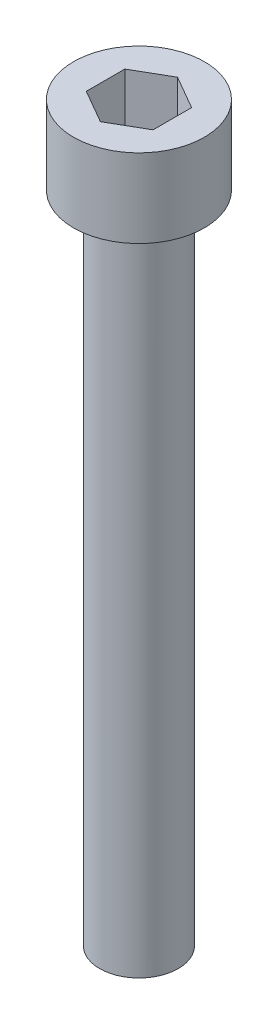
ISO-10303-21;
HEADER;
FILE_DESCRIPTION(('STEP AP214'),'2;1');
FILE_NAME('part.step','',(''),(''),'','','');
FILE_SCHEMA(('AUTOMOTIVE_DESIGN { 1 0 10303 214 1 1 1 1 }'));
ENDSEC;
DATA;
#1=APPLICATION_CONTEXT('core data for automotive mechanical design processes');
#2=APPLICATION_PROTOCOL_DEFINITION('international standard','automotive_design',2000,#1);
#3=PRODUCT_CONTEXT('',#1,'mechanical');
#4=PRODUCT('Part','Part','',(#3));
#5=PRODUCT_RELATED_PRODUCT_CATEGORY('part','',(#4));
#6=PRODUCT_DEFINITION_FORMATION('','',#4);
#7=PRODUCT_DEFINITION_CONTEXT('part definition',#1,'design');
#8=PRODUCT_DEFINITION('design','',#6,#7);
#9=PRODUCT_DEFINITION_SHAPE('','',#8);
#10=(LENGTH_UNIT() NAMED_UNIT(*) SI_UNIT(.MILLI.,.METRE.));
#11=(NAMED_UNIT(*) PLANE_ANGLE_UNIT() SI_UNIT($,.RADIAN.));
#12=(NAMED_UNIT(*) SI_UNIT($,.STERADIAN.) SOLID_ANGLE_UNIT());
#13=UNCERTAINTY_MEASURE_WITH_UNIT(LENGTH_MEASURE(1.E-05),#10,'distance_accuracy_value','');
#14=(GEOMETRIC_REPRESENTATION_CONTEXT(3) GLOBAL_UNCERTAINTY_ASSIGNED_CONTEXT((#13)) GLOBAL_UNIT_ASSIGNED_CONTEXT((#10,
#11,#12)) REPRESENTATION_CONTEXT('',''));
#15=CARTESIAN_POINT('',(0.,0.,0.));
#16=DIRECTION('',(0.,0.,1.));
#17=DIRECTION('',(1.,0.,0.));
#18=AXIS2_PLACEMENT_3D('',#15,#16,#17);
#19=CARTESIAN_POINT('',(0.,0.,0.));
#20=DIRECTION('',(0.,1.,0.));
#21=DIRECTION('',(0.,0.,1.));
#22=AXIS2_PLACEMENT_3D('',#19,#20,#21);
#23=PLANE('',#22);
#24=CARTESIAN_POINT('',(0.,0.,0.));
#25=DIRECTION('',(0.,1.,0.));
#26=DIRECTION('',(0.,0.,1.));
#27=AXIS2_PLACEMENT_3D('',#24,#25,#26);
#28=CIRCLE('',#27,5.);
#29=CARTESIAN_POINT('',(0.,0.,5.));
#30=VERTEX_POINT('',#29);
#31=EDGE_CURVE('E143',#30,#30,#28,.T.);
#32=ORIENTED_EDGE('',*,*,#31,.F.);
#33=EDGE_LOOP('',(#32));
#34=FACE_BOUND('',#33,.T.);
#35=CARTESIAN_POINT('',(0.,0.,0.));
#36=DIRECTION('',(0.,1.,0.));
#37=DIRECTION('',(0.,0.,1.));
#38=AXIS2_PLACEMENT_3D('',#35,#36,#37);
#39=CIRCLE('',#38,3.);
#40=CARTESIAN_POINT('',(0.,0.,3.));
#41=VERTEX_POINT('',#40);
#42=EDGE_CURVE('E11',#41,#41,#39,.F.);
#43=ORIENTED_EDGE('',*,*,#42,.F.);
#44=EDGE_LOOP('',(#43));
#45=FACE_BOUND('',#44,.T.);
#46=ADVANCED_FACE('F32',(#34,#45),#23,.F.);
#47=CARTESIAN_POINT('',(0.,6.,0.));
#48=DIRECTION('',(0.,1.,0.));
#49=DIRECTION('',(0.,0.,1.));
#50=AXIS2_PLACEMENT_3D('',#47,#48,#49);
#51=PLANE('',#50);
#52=CARTESIAN_POINT('',(0.,6.,0.));
#53=DIRECTION('',(0.,1.,0.));
#54=DIRECTION('',(0.,0.,1.));
#55=AXIS2_PLACEMENT_3D('',#52,#53,#54);
#56=CIRCLE('',#55,5.);
#57=CARTESIAN_POINT('',(0.,6.,5.));
#58=VERTEX_POINT('',#57);
#59=EDGE_CURVE('E40',#58,#58,#56,.T.);
#60=ORIENTED_EDGE('',*,*,#59,.T.);
#61=EDGE_LOOP('',(#60));
#62=FACE_BOUND('',#61,.T.);
#63=DIRECTION('',(0.866025403784439,0.,-0.5));
#64=VECTOR('',#63,1.);
#65=CARTESIAN_POINT('',(0.,6.,2.94448637286712));
#66=LINE('',#65,#64);
#67=CARTESIAN_POINT('',(0.,6.,2.94448637286712));
#68=VERTEX_POINT('',#67);
#69=CARTESIAN_POINT('',(2.55000000000002,6.,1.47224318643356));
#70=VERTEX_POINT('',#69);
#71=EDGE_CURVE('E102',#68,#70,#66,.T.);
#72=ORIENTED_EDGE('',*,*,#71,.F.);
#73=DIRECTION('',(0.866025403784439,0.,0.5));
#74=VECTOR('',#73,1.);
#75=CARTESIAN_POINT('',(-2.55000000000002,6.,1.47224318643356));
#76=LINE('',#75,#74);
#77=CARTESIAN_POINT('',(-2.55000000000002,6.,1.47224318643356));
#78=VERTEX_POINT('',#77);
#79=EDGE_CURVE('E82',#78,#68,#76,.T.);
#80=ORIENTED_EDGE('',*,*,#79,.F.);
#81=DIRECTION('',(0.,0.,1.));
#82=VECTOR('',#81,1.);
#83=CARTESIAN_POINT('',(-2.55000000000002,6.,-1.47224318643356));
#84=LINE('',#83,#82);
#85=CARTESIAN_POINT('',(-2.55000000000002,6.,-1.47224318643356));
#86=VERTEX_POINT('',#85);
#87=EDGE_CURVE('E53',#86,#78,#84,.T.);
#88=ORIENTED_EDGE('',*,*,#87,.F.);
#89=DIRECTION('',(-0.866025403784439,0.,0.5));
#90=VECTOR('',#89,1.);
#91=CARTESIAN_POINT('',(0.,6.,-2.94448637286712));
#92=LINE('',#91,#90);
#93=CARTESIAN_POINT('',(0.,6.,-2.94448637286712));
#94=VERTEX_POINT('',#93);
#95=EDGE_CURVE('E114',#94,#86,#92,.T.);
#96=ORIENTED_EDGE('',*,*,#95,.F.);
#97=DIRECTION('',(-0.866025403784439,0.,-0.5));
#98=VECTOR('',#97,1.);
#99=CARTESIAN_POINT('',(2.55000000000002,6.,-1.47224318643356));
#100=LINE('',#99,#98);
#101=CARTESIAN_POINT('',(2.55000000000002,6.,-1.47224318643356));
#102=VERTEX_POINT('',#101);
#103=EDGE_CURVE('E101',#102,#94,#100,.T.);
#104=ORIENTED_EDGE('',*,*,#103,.F.);
#105=DIRECTION('',(0.,0.,-1.));
#106=VECTOR('',#105,1.);
#107=CARTESIAN_POINT('',(2.55000000000002,6.,1.47224318643356));
#108=LINE('',#107,#106);
#109=EDGE_CURVE('E91',#70,#102,#108,.T.);
#110=ORIENTED_EDGE('',*,*,#109,.F.);
#111=EDGE_LOOP('',(#72,#80,#88,#96,#104,#110));
#112=FACE_BOUND('',#111,.T.);
#113=ADVANCED_FACE('F113',(#62,#112),#51,.T.);
#114=CARTESIAN_POINT('',(0.,6.,0.));
#115=DIRECTION('',(0.,-1.,0.));
#116=DIRECTION('',(0.,0.,-1.));
#117=AXIS2_PLACEMENT_3D('',#114,#115,#116);
#118=CYLINDRICAL_SURFACE('',#117,5.);
#119=ORIENTED_EDGE('',*,*,#59,.F.);
#120=EDGE_LOOP('',(#119));
#121=FACE_BOUND('',#120,.T.);
#122=ORIENTED_EDGE('',*,*,#31,.T.);
#123=EDGE_LOOP('',(#122));
#124=FACE_BOUND('',#123,.T.);
#125=ADVANCED_FACE('F34',(#121,#124),#118,.T.);
#126=CARTESIAN_POINT('',(-2.55000000000002,6.,1.47224318643356));
#127=DIRECTION('',(0.5,0.,-0.866025403784438));
#128=DIRECTION('',(-0.866025403784439,0.,-0.5));
#129=AXIS2_PLACEMENT_3D('',#126,#127,#128);
#130=PLANE('',#129);
#131=DIRECTION('',(0.866025403784439,0.,0.5));
#132=VECTOR('',#131,1.);
#133=CARTESIAN_POINT('',(-2.55000000000002,0.,1.47224318643356));
#134=LINE('',#133,#132);
#135=CARTESIAN_POINT('',(-2.55000000000002,0.,1.47224318643356));
#136=VERTEX_POINT('',#135);
#137=CARTESIAN_POINT('',(0.,0.,2.94448637286712));
#138=VERTEX_POINT('',#137);
#139=EDGE_CURVE('E121',#136,#138,#134,.T.);
#140=ORIENTED_EDGE('',*,*,#139,.F.);
#141=DIRECTION('',(0.,-1.,0.));
#142=VECTOR('',#141,1.);
#143=CARTESIAN_POINT('',(-2.55000000000002,6.,1.47224318643356));
#144=LINE('',#143,#142);
#145=EDGE_CURVE('E120',#78,#136,#144,.T.);
#146=ORIENTED_EDGE('',*,*,#145,.F.);
#147=ORIENTED_EDGE('',*,*,#79,.T.);
#148=DIRECTION('',(0.,-1.,0.));
#149=VECTOR('',#148,1.);
#150=CARTESIAN_POINT('',(0.,6.,2.94448637286712));
#151=LINE('',#150,#149);
#152=EDGE_CURVE('E141',#68,#138,#151,.T.);
#153=ORIENTED_EDGE('',*,*,#152,.T.);
#154=EDGE_LOOP('',(#140,#146,#147,#153));
#155=FACE_BOUND('',#154,.T.);
#156=ADVANCED_FACE('F182',(#155),#130,.T.);
#157=CARTESIAN_POINT('',(0.,6.,2.94448637286712));
#158=DIRECTION('',(-0.5,0.,-0.866025403784438));
#159=DIRECTION('',(-0.866025403784439,0.,0.5));
#160=AXIS2_PLACEMENT_3D('',#157,#158,#159);
#161=PLANE('',#160);
#162=DIRECTION('',(0.866025403784439,0.,-0.5));
#163=VECTOR('',#162,1.);
#164=CARTESIAN_POINT('',(0.,0.,2.94448637286712));
#165=LINE('',#164,#163);
#166=CARTESIAN_POINT('',(2.55000000000002,0.,1.47224318643356));
#167=VERTEX_POINT('',#166);
#168=EDGE_CURVE('E124',#138,#167,#165,.T.);
#169=ORIENTED_EDGE('',*,*,#168,.F.);
#170=ORIENTED_EDGE('',*,*,#152,.F.);
#171=ORIENTED_EDGE('',*,*,#71,.T.);
#172=DIRECTION('',(0.,-1.,0.));
#173=VECTOR('',#172,1.);
#174=CARTESIAN_POINT('',(2.55000000000002,6.,1.47224318643356));
#175=LINE('',#174,#173);
#176=EDGE_CURVE('E97',#70,#167,#175,.T.);
#177=ORIENTED_EDGE('',*,*,#176,.T.);
#178=EDGE_LOOP('',(#169,#170,#171,#177));
#179=FACE_BOUND('',#178,.T.);
#180=ADVANCED_FACE('F179',(#179),#161,.T.);
#181=CARTESIAN_POINT('',(2.55000000000002,6.,1.47224318643356));
#182=DIRECTION('',(-1.,0.,0.));
#183=DIRECTION('',(0.,0.,1.));
#184=AXIS2_PLACEMENT_3D('',#181,#182,#183);
#185=PLANE('',#184);
#186=DIRECTION('',(0.,0.,-1.));
#187=VECTOR('',#186,1.);
#188=CARTESIAN_POINT('',(2.55000000000002,0.,1.47224318643356));
#189=LINE('',#188,#187);
#190=CARTESIAN_POINT('',(2.55000000000002,0.,-1.47224318643356));
#191=VERTEX_POINT('',#190);
#192=EDGE_CURVE('E128',#167,#191,#189,.T.);
#193=ORIENTED_EDGE('',*,*,#192,.F.);
#194=ORIENTED_EDGE('',*,*,#176,.F.);
#195=ORIENTED_EDGE('',*,*,#109,.T.);
#196=DIRECTION('',(0.,-1.,0.));
#197=VECTOR('',#196,1.);
#198=CARTESIAN_POINT('',(2.55000000000002,6.,-1.47224318643356));
#199=LINE('',#198,#197);
#200=EDGE_CURVE('E95',#102,#191,#199,.T.);
#201=ORIENTED_EDGE('',*,*,#200,.T.);
#202=EDGE_LOOP('',(#193,#194,#195,#201));
#203=FACE_BOUND('',#202,.T.);
#204=ADVANCED_FACE('F94',(#203),#185,.T.);
#205=CARTESIAN_POINT('',(2.55000000000002,6.,-1.47224318643356));
#206=DIRECTION('',(-0.5,0.,0.866025403784439));
#207=DIRECTION('',(0.866025403784439,0.,0.5));
#208=AXIS2_PLACEMENT_3D('',#205,#206,#207);
#209=PLANE('',#208);
#210=DIRECTION('',(-0.866025403784439,0.,-0.5));
#211=VECTOR('',#210,1.);
#212=CARTESIAN_POINT('',(2.55000000000002,0.,-1.47224318643356));
#213=LINE('',#212,#211);
#214=CARTESIAN_POINT('',(0.,0.,-2.94448637286712));
#215=VERTEX_POINT('',#214);
#216=EDGE_CURVE('E108',#191,#215,#213,.T.);
#217=ORIENTED_EDGE('',*,*,#216,.F.);
#218=ORIENTED_EDGE('',*,*,#200,.F.);
#219=ORIENTED_EDGE('',*,*,#103,.T.);
#220=DIRECTION('',(0.,-1.,0.));
#221=VECTOR('',#220,1.);
#222=CARTESIAN_POINT('',(0.,6.,-2.94448637286712));
#223=LINE('',#222,#221);
#224=EDGE_CURVE('E110',#94,#215,#223,.T.);
#225=ORIENTED_EDGE('',*,*,#224,.T.);
#226=EDGE_LOOP('',(#217,#218,#219,#225));
#227=FACE_BOUND('',#226,.T.);
#228=ADVANCED_FACE('F105',(#227),#209,.T.);
#229=CARTESIAN_POINT('',(0.,6.,-2.94448637286712));
#230=DIRECTION('',(0.5,0.,0.866025403784438));
#231=DIRECTION('',(0.866025403784439,0.,-0.5));
#232=AXIS2_PLACEMENT_3D('',#229,#230,#231);
#233=PLANE('',#232);
#234=DIRECTION('',(-0.866025403784439,0.,0.5));
#235=VECTOR('',#234,1.);
#236=CARTESIAN_POINT('',(0.,0.,-2.94448637286712));
#237=LINE('',#236,#235);
#238=CARTESIAN_POINT('',(-2.55000000000002,0.,-1.47224318643356));
#239=VERTEX_POINT('',#238);
#240=EDGE_CURVE('E131',#215,#239,#237,.T.);
#241=ORIENTED_EDGE('',*,*,#240,.F.);
#242=ORIENTED_EDGE('',*,*,#224,.F.);
#243=ORIENTED_EDGE('',*,*,#95,.T.);
#244=DIRECTION('',(0.,-1.,0.));
#245=VECTOR('',#244,1.);
#246=CARTESIAN_POINT('',(-2.55000000000002,6.,-1.47224318643356));
#247=LINE('',#246,#245);
#248=EDGE_CURVE('E47',#86,#239,#247,.T.);
#249=ORIENTED_EDGE('',*,*,#248,.T.);
#250=EDGE_LOOP('',(#241,#242,#243,#249));
#251=FACE_BOUND('',#250,.T.);
#252=ADVANCED_FACE('F172',(#251),#233,.T.);
#253=CARTESIAN_POINT('',(-2.55000000000002,6.,-1.47224318643356));
#254=DIRECTION('',(1.,0.,0.));
#255=DIRECTION('',(0.,0.,-1.));
#256=AXIS2_PLACEMENT_3D('',#253,#254,#255);
#257=PLANE('',#256);
#258=DIRECTION('',(0.,0.,1.));
#259=VECTOR('',#258,1.);
#260=CARTESIAN_POINT('',(-2.55000000000002,0.,-1.47224318643356));
#261=LINE('',#260,#259);
#262=EDGE_CURVE('E134',#239,#136,#261,.T.);
#263=ORIENTED_EDGE('',*,*,#262,.F.);
#264=ORIENTED_EDGE('',*,*,#248,.F.);
#265=ORIENTED_EDGE('',*,*,#87,.T.);
#266=ORIENTED_EDGE('',*,*,#145,.T.);
#267=EDGE_LOOP('',(#263,#264,#265,#266));
#268=FACE_BOUND('',#267,.T.);
#269=ADVANCED_FACE('F165',(#268),#257,.T.);
#270=CARTESIAN_POINT('',(0.,0.,0.));
#271=DIRECTION('',(0.,-1.,0.));
#272=DIRECTION('',(0.,0.,-1.));
#273=AXIS2_PLACEMENT_3D('',#270,#271,#272);
#274=PLANE('',#273);
#275=ORIENTED_EDGE('',*,*,#139,.T.);
#276=ORIENTED_EDGE('',*,*,#168,.T.);
#277=ORIENTED_EDGE('',*,*,#192,.T.);
#278=ORIENTED_EDGE('',*,*,#216,.T.);
#279=ORIENTED_EDGE('',*,*,#240,.T.);
#280=ORIENTED_EDGE('',*,*,#262,.T.);
#281=EDGE_LOOP('',(#275,#276,#277,#278,#279,#280));
#282=FACE_BOUND('',#281,.T.);
#283=ADVANCED_FACE('F156',(#282),#274,.F.);
#284=CARTESIAN_POINT('',(0.,-50.,0.));
#285=DIRECTION('',(0.,1.,0.));
#286=DIRECTION('',(0.,0.,1.));
#287=AXIS2_PLACEMENT_3D('',#284,#285,#286);
#288=CYLINDRICAL_SURFACE('',#287,3.);
#289=CARTESIAN_POINT('',(0.,-50.,0.));
#290=DIRECTION('',(0.,-1.,0.));
#291=DIRECTION('',(0.,0.,-1.));
#292=AXIS2_PLACEMENT_3D('',#289,#290,#291);
#293=CIRCLE('',#292,3.);
#294=CARTESIAN_POINT('',(0.,-50.,-3.));
#295=VERTEX_POINT('',#294);
#296=EDGE_CURVE('E125',#295,#295,#293,.T.);
#297=ORIENTED_EDGE('',*,*,#296,.F.);
#298=EDGE_LOOP('',(#297));
#299=FACE_BOUND('',#298,.T.);
#300=ORIENTED_EDGE('',*,*,#42,.T.);
#301=EDGE_LOOP('',(#300));
#302=FACE_BOUND('',#301,.T.);
#303=ADVANCED_FACE('F153',(#299,#302),#288,.T.);
#304=CARTESIAN_POINT('',(0.,-50.,0.));
#305=DIRECTION('',(0.,-1.,0.));
#306=DIRECTION('',(0.,0.,-1.));
#307=AXIS2_PLACEMENT_3D('',#304,#305,#306);
#308=PLANE('',#307);
#309=ORIENTED_EDGE('',*,*,#296,.T.);
#310=EDGE_LOOP('',(#309));
#311=FACE_BOUND('',#310,.T.);
#312=ADVANCED_FACE('F155',(#311),#308,.T.);
#313=CLOSED_SHELL('',(#46,#113,#125,#156,#180,#204,#228,#252,#269,#283,#303,#312));
#314=MANIFOLD_SOLID_BREP('B2',#313);
#315=ADVANCED_BREP_SHAPE_REPRESENTATION('',(#18,#314),#14);
#316=SHAPE_DEFINITION_REPRESENTATION(#9,#315);
ENDSEC;
END-ISO-10303-21;
